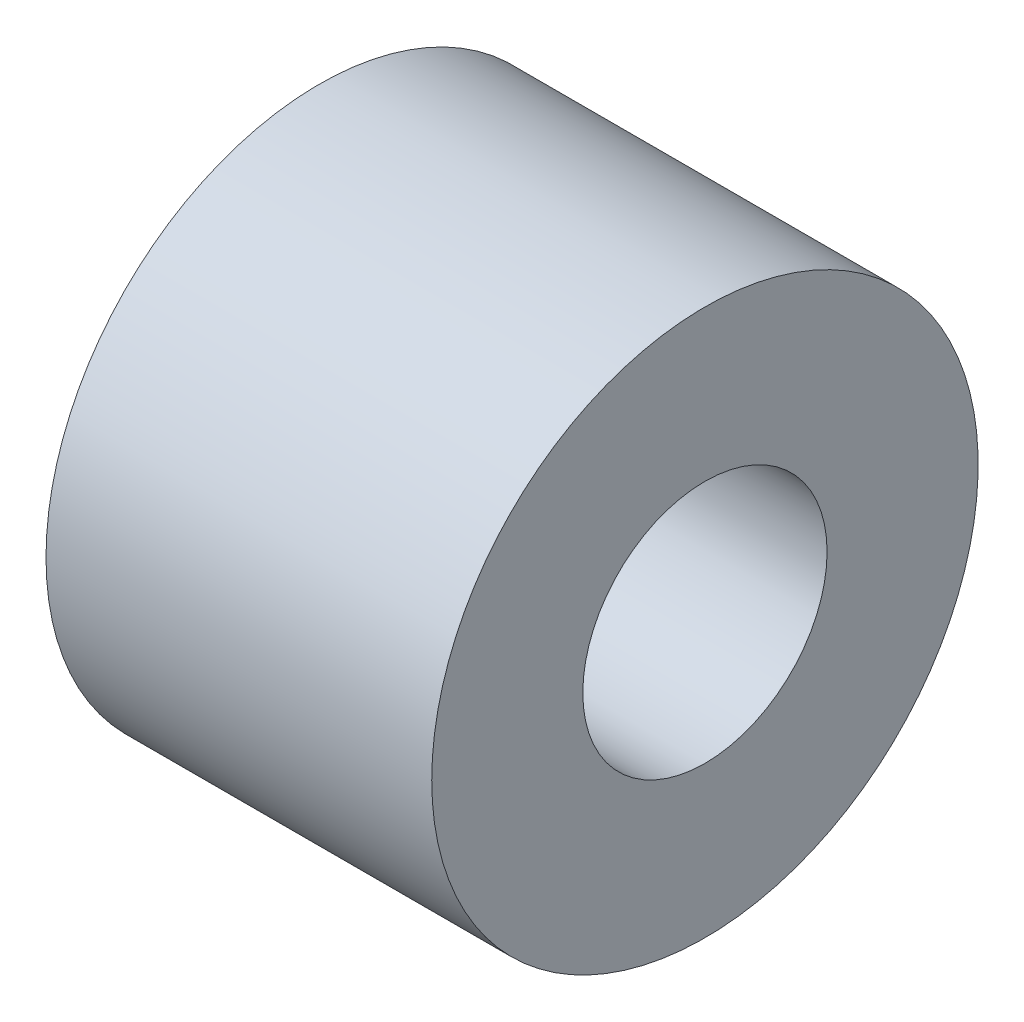
ISO-10303-21;
HEADER;
FILE_DESCRIPTION(('STEP AP214'),'2;1');
FILE_NAME('part.step','',(''),(''),'','','');
FILE_SCHEMA(('AUTOMOTIVE_DESIGN { 1 0 10303 214 1 1 1 1 }'));
ENDSEC;
DATA;
#1=APPLICATION_CONTEXT('core data for automotive mechanical design processes');
#2=APPLICATION_PROTOCOL_DEFINITION('international standard','automotive_design',2000,#1);
#3=PRODUCT_CONTEXT('',#1,'mechanical');
#4=PRODUCT('Part','Part','',(#3));
#5=PRODUCT_RELATED_PRODUCT_CATEGORY('part','',(#4));
#6=PRODUCT_DEFINITION_FORMATION('','',#4);
#7=PRODUCT_DEFINITION_CONTEXT('part definition',#1,'design');
#8=PRODUCT_DEFINITION('design','',#6,#7);
#9=PRODUCT_DEFINITION_SHAPE('','',#8);
#10=(LENGTH_UNIT() NAMED_UNIT(*) SI_UNIT(.MILLI.,.METRE.));
#11=(NAMED_UNIT(*) PLANE_ANGLE_UNIT() SI_UNIT($,.RADIAN.));
#12=(NAMED_UNIT(*) SI_UNIT($,.STERADIAN.) SOLID_ANGLE_UNIT());
#13=UNCERTAINTY_MEASURE_WITH_UNIT(LENGTH_MEASURE(1.E-05),#10,'distance_accuracy_value','');
#14=(GEOMETRIC_REPRESENTATION_CONTEXT(3) GLOBAL_UNCERTAINTY_ASSIGNED_CONTEXT((#13)) GLOBAL_UNIT_ASSIGNED_CONTEXT((#10,
#11,#12)) REPRESENTATION_CONTEXT('',''));
#15=CARTESIAN_POINT('',(0.,0.,0.));
#16=DIRECTION('',(0.,0.,1.));
#17=DIRECTION('',(1.,0.,0.));
#18=AXIS2_PLACEMENT_3D('',#15,#16,#17);
#19=CARTESIAN_POINT('',(3.81,0.,0.));
#20=DIRECTION('',(1.,0.,0.));
#21=DIRECTION('',(0.,0.,-1.));
#22=AXIS2_PLACEMENT_3D('',#19,#20,#21);
#23=PLANE('',#22);
#24=CARTESIAN_POINT('',(3.81,0.,0.));
#25=DIRECTION('',(1.,0.,0.));
#26=DIRECTION('',(0.,0.,-1.));
#27=AXIS2_PLACEMENT_3D('',#24,#25,#26);
#28=CIRCLE('',#27,5.3975);
#29=CARTESIAN_POINT('',(3.81,0.,5.3975));
#30=VERTEX_POINT('',#29);
#31=EDGE_CURVE('E10',#30,#30,#28,.T.);
#32=ORIENTED_EDGE('',*,*,#31,.T.);
#33=EDGE_LOOP('',(#32));
#34=FACE_BOUND('',#33,.T.);
#35=CARTESIAN_POINT('',(3.81,0.,0.));
#36=DIRECTION('',(1.,0.,0.));
#37=DIRECTION('',(0.,0.,-1.));
#38=AXIS2_PLACEMENT_3D('',#35,#36,#37);
#39=CIRCLE('',#38,2.413);
#40=CARTESIAN_POINT('',(3.81,0.,2.413));
#41=VERTEX_POINT('',#40);
#42=EDGE_CURVE('E48',#41,#41,#39,.T.);
#43=ORIENTED_EDGE('',*,*,#42,.F.);
#44=EDGE_LOOP('',(#43));
#45=FACE_BOUND('',#44,.T.);
#46=ADVANCED_FACE('F37',(#34,#45),#23,.T.);
#47=CARTESIAN_POINT('',(-3.81,0.,0.));
#48=DIRECTION('',(1.,0.,0.));
#49=DIRECTION('',(0.,0.,-1.));
#50=AXIS2_PLACEMENT_3D('',#47,#48,#49);
#51=PLANE('',#50);
#52=CARTESIAN_POINT('',(-3.81,0.,0.));
#53=DIRECTION('',(1.,0.,0.));
#54=DIRECTION('',(0.,0.,-1.));
#55=AXIS2_PLACEMENT_3D('',#52,#53,#54);
#56=CIRCLE('',#55,5.3975);
#57=CARTESIAN_POINT('',(-3.81,0.,5.3975));
#58=VERTEX_POINT('',#57);
#59=EDGE_CURVE('E41',#58,#58,#56,.T.);
#60=ORIENTED_EDGE('',*,*,#59,.F.);
#61=EDGE_LOOP('',(#60));
#62=FACE_BOUND('',#61,.T.);
#63=CARTESIAN_POINT('',(-3.81,0.,0.));
#64=DIRECTION('',(1.,0.,0.));
#65=DIRECTION('',(0.,0.,-1.));
#66=AXIS2_PLACEMENT_3D('',#63,#64,#65);
#67=CIRCLE('',#66,2.413);
#68=CARTESIAN_POINT('',(-3.81,0.,2.413));
#69=VERTEX_POINT('',#68);
#70=EDGE_CURVE('E50',#69,#69,#67,.T.);
#71=ORIENTED_EDGE('',*,*,#70,.T.);
#72=EDGE_LOOP('',(#71));
#73=FACE_BOUND('',#72,.T.);
#74=ADVANCED_FACE('F60',(#62,#73),#51,.F.);
#75=CARTESIAN_POINT('',(3.81,0.,0.));
#76=DIRECTION('',(-1.,0.,0.));
#77=DIRECTION('',(0.,0.,1.));
#78=AXIS2_PLACEMENT_3D('',#75,#76,#77);
#79=CYLINDRICAL_SURFACE('',#78,5.3975);
#80=CARTESIAN_POINT('',(3.81,0.,5.3975));
#81=CARTESIAN_POINT('',(3.730625,0.,5.3975));
#82=CARTESIAN_POINT('',(3.65125,0.,5.3975));
#83=CARTESIAN_POINT('',(3.4925,0.,5.3975));
#84=CARTESIAN_POINT('',(3.413125,0.,5.3975));
#85=CARTESIAN_POINT('',(3.254375,0.,5.3975));
#86=CARTESIAN_POINT('',(3.175,0.,5.3975));
#87=CARTESIAN_POINT('',(3.01625,0.,5.3975));
#88=CARTESIAN_POINT('',(2.936875,0.,5.3975));
#89=CARTESIAN_POINT('',(2.778125,0.,5.3975));
#90=CARTESIAN_POINT('',(2.69875,0.,5.3975));
#91=CARTESIAN_POINT('',(2.54,0.,5.3975));
#92=CARTESIAN_POINT('',(2.460625,0.,5.3975));
#93=CARTESIAN_POINT('',(2.301875,0.,5.3975));
#94=CARTESIAN_POINT('',(2.2225,0.,5.3975));
#95=CARTESIAN_POINT('',(2.06375,0.,5.3975));
#96=CARTESIAN_POINT('',(1.984375,0.,5.3975));
#97=CARTESIAN_POINT('',(1.825625,0.,5.3975));
#98=CARTESIAN_POINT('',(1.74625,0.,5.3975));
#99=CARTESIAN_POINT('',(1.5875,0.,5.3975));
#100=CARTESIAN_POINT('',(1.508125,0.,5.3975));
#101=CARTESIAN_POINT('',(1.349375,0.,5.3975));
#102=CARTESIAN_POINT('',(1.27,0.,5.3975));
#103=CARTESIAN_POINT('',(1.11125,0.,5.3975));
#104=CARTESIAN_POINT('',(1.031875,0.,5.3975));
#105=CARTESIAN_POINT('',(0.873125,0.,5.3975));
#106=CARTESIAN_POINT('',(0.79375,0.,5.3975));
#107=CARTESIAN_POINT('',(0.635,0.,5.3975));
#108=CARTESIAN_POINT('',(0.555625,0.,5.3975));
#109=CARTESIAN_POINT('',(0.396875,0.,5.3975));
#110=CARTESIAN_POINT('',(0.3175,0.,5.3975));
#111=CARTESIAN_POINT('',(0.15875,0.,5.3975));
#112=CARTESIAN_POINT('',(0.0793749999999996,0.,5.3975));
#113=CARTESIAN_POINT('',(-0.079375,0.,5.3975));
#114=CARTESIAN_POINT('',(-0.15875,0.,5.3975));
#115=CARTESIAN_POINT('',(-0.317499999999999,0.,5.3975));
#116=CARTESIAN_POINT('',(-0.396874999999999,0.,5.3975));
#117=CARTESIAN_POINT('',(-0.555625,0.,5.3975));
#118=CARTESIAN_POINT('',(-0.634999999999999,0.,5.3975));
#119=CARTESIAN_POINT('',(-0.79375,0.,5.3975));
#120=CARTESIAN_POINT('',(-0.873125,0.,5.3975));
#121=CARTESIAN_POINT('',(-1.031875,0.,5.3975));
#122=CARTESIAN_POINT('',(-1.11125,0.,5.3975));
#123=CARTESIAN_POINT('',(-1.27,0.,5.3975));
#124=CARTESIAN_POINT('',(-1.349375,0.,5.3975));
#125=CARTESIAN_POINT('',(-1.508125,0.,5.3975));
#126=CARTESIAN_POINT('',(-1.5875,0.,5.3975));
#127=CARTESIAN_POINT('',(-1.74625,0.,5.3975));
#128=CARTESIAN_POINT('',(-1.825625,0.,5.3975));
#129=CARTESIAN_POINT('',(-1.984375,0.,5.3975));
#130=CARTESIAN_POINT('',(-2.06375,0.,5.3975));
#131=CARTESIAN_POINT('',(-2.2225,0.,5.3975));
#132=CARTESIAN_POINT('',(-2.301875,0.,5.3975));
#133=CARTESIAN_POINT('',(-2.460625,0.,5.3975));
#134=CARTESIAN_POINT('',(-2.54,0.,5.3975));
#135=CARTESIAN_POINT('',(-2.69875,0.,5.3975));
#136=CARTESIAN_POINT('',(-2.778125,0.,5.3975));
#137=CARTESIAN_POINT('',(-2.936875,0.,5.3975));
#138=CARTESIAN_POINT('',(-3.01625,0.,5.3975));
#139=CARTESIAN_POINT('',(-3.175,0.,5.3975));
#140=CARTESIAN_POINT('',(-3.254375,0.,5.3975));
#141=CARTESIAN_POINT('',(-3.413125,0.,5.3975));
#142=CARTESIAN_POINT('',(-3.4925,0.,5.3975));
#143=CARTESIAN_POINT('',(-3.65125,0.,5.3975));
#144=CARTESIAN_POINT('',(-3.730625,0.,5.3975));
#145=CARTESIAN_POINT('',(-3.81,0.,5.3975));
#146=B_SPLINE_CURVE_WITH_KNOTS('',3,(#80,#81,#82,#83,#84,#85,#86,#87,#88,#89,#90,#91,#92,#93,
#94,#95,#96,#97,#98,#99,#100,#101,#102,#103,#104,#105,#106,#107,#108,#109,#110,#111,#112,#113,
#114,#115,#116,#117,#118,#119,#120,#121,#122,#123,#124,#125,#126,#127,#128,#129,#130,#131,#132,
#133,#134,#135,#136,#137,#138,#139,#140,#141,#142,#143,#144,#145),.UNSPECIFIED.,.F.,.F.,(4,2,2,
2,2,2,2,2,2,2,2,2,2,2,2,2,2,2,2,2,2,2,2,2,2,2,2,2,2,2,2,2,4),(0.,0.238125,0.47625,0.714375,
0.9525,1.190625,1.42875,1.666875,1.905,2.143125,2.38125,2.619375,2.8575,3.095625,3.33375,
3.571875,3.81,4.048125,4.28625,4.524375,4.7625,5.000625,5.23875,5.476875,5.715,5.953125,6.19125,
6.429375,6.6675,6.905625,7.14375,7.381875,7.62),.UNSPECIFIED.);
#147=EDGE_CURVE('BSEAM39',#30,#58,#146,.T.);
#148=ORIENTED_EDGE('',*,*,#31,.F.);
#149=ORIENTED_EDGE('',*,*,#59,.T.);
#150=ORIENTED_EDGE('',*,*,#147,.T.);
#151=ORIENTED_EDGE('',*,*,#147,.F.);
#152=EDGE_LOOP('',(#148,#150,#149,#151));
#153=FACE_BOUND('',#152,.T.);
#154=ADVANCED_FACE('F39',(#153),#79,.T.);
#155=CARTESIAN_POINT('',(3.81,0.,0.));
#156=DIRECTION('',(-1.,0.,0.));
#157=DIRECTION('',(0.,0.,1.));
#158=AXIS2_PLACEMENT_3D('',#155,#156,#157);
#159=CYLINDRICAL_SURFACE('',#158,2.413);
#160=CARTESIAN_POINT('',(3.81,0.,2.413));
#161=CARTESIAN_POINT('',(3.730625,0.,2.413));
#162=CARTESIAN_POINT('',(3.65125,0.,2.413));
#163=CARTESIAN_POINT('',(3.4925,0.,2.413));
#164=CARTESIAN_POINT('',(3.413125,0.,2.413));
#165=CARTESIAN_POINT('',(3.254375,0.,2.413));
#166=CARTESIAN_POINT('',(3.175,0.,2.413));
#167=CARTESIAN_POINT('',(3.01625,0.,2.413));
#168=CARTESIAN_POINT('',(2.936875,0.,2.413));
#169=CARTESIAN_POINT('',(2.778125,0.,2.413));
#170=CARTESIAN_POINT('',(2.69875,0.,2.413));
#171=CARTESIAN_POINT('',(2.54,0.,2.413));
#172=CARTESIAN_POINT('',(2.460625,0.,2.413));
#173=CARTESIAN_POINT('',(2.301875,0.,2.413));
#174=CARTESIAN_POINT('',(2.2225,0.,2.413));
#175=CARTESIAN_POINT('',(2.06375,0.,2.413));
#176=CARTESIAN_POINT('',(1.984375,0.,2.413));
#177=CARTESIAN_POINT('',(1.825625,0.,2.413));
#178=CARTESIAN_POINT('',(1.74625,0.,2.413));
#179=CARTESIAN_POINT('',(1.5875,0.,2.413));
#180=CARTESIAN_POINT('',(1.508125,0.,2.413));
#181=CARTESIAN_POINT('',(1.349375,0.,2.413));
#182=CARTESIAN_POINT('',(1.27,0.,2.413));
#183=CARTESIAN_POINT('',(1.11125,0.,2.413));
#184=CARTESIAN_POINT('',(1.031875,0.,2.413));
#185=CARTESIAN_POINT('',(0.873125,0.,2.413));
#186=CARTESIAN_POINT('',(0.79375,0.,2.413));
#187=CARTESIAN_POINT('',(0.635,0.,2.413));
#188=CARTESIAN_POINT('',(0.555625,0.,2.413));
#189=CARTESIAN_POINT('',(0.396875,0.,2.413));
#190=CARTESIAN_POINT('',(0.3175,0.,2.413));
#191=CARTESIAN_POINT('',(0.15875,0.,2.413));
#192=CARTESIAN_POINT('',(0.079375,0.,2.413));
#193=CARTESIAN_POINT('',(-0.0793749999999997,0.,2.413));
#194=CARTESIAN_POINT('',(-0.158749999999999,0.,2.413));
#195=CARTESIAN_POINT('',(-0.317499999999999,0.,2.413));
#196=CARTESIAN_POINT('',(-0.396874999999999,0.,2.413));
#197=CARTESIAN_POINT('',(-0.555625,0.,2.413));
#198=CARTESIAN_POINT('',(-0.634999999999999,0.,2.413));
#199=CARTESIAN_POINT('',(-0.79375,0.,2.413));
#200=CARTESIAN_POINT('',(-0.873125,0.,2.413));
#201=CARTESIAN_POINT('',(-1.031875,0.,2.413));
#202=CARTESIAN_POINT('',(-1.11125,0.,2.413));
#203=CARTESIAN_POINT('',(-1.27,0.,2.413));
#204=CARTESIAN_POINT('',(-1.349375,0.,2.413));
#205=CARTESIAN_POINT('',(-1.508125,0.,2.413));
#206=CARTESIAN_POINT('',(-1.5875,0.,2.413));
#207=CARTESIAN_POINT('',(-1.74625,0.,2.413));
#208=CARTESIAN_POINT('',(-1.825625,0.,2.413));
#209=CARTESIAN_POINT('',(-1.984375,0.,2.413));
#210=CARTESIAN_POINT('',(-2.06375,0.,2.413));
#211=CARTESIAN_POINT('',(-2.2225,0.,2.413));
#212=CARTESIAN_POINT('',(-2.301875,0.,2.413));
#213=CARTESIAN_POINT('',(-2.460625,0.,2.413));
#214=CARTESIAN_POINT('',(-2.54,0.,2.413));
#215=CARTESIAN_POINT('',(-2.69875,0.,2.413));
#216=CARTESIAN_POINT('',(-2.778125,0.,2.413));
#217=CARTESIAN_POINT('',(-2.936875,0.,2.413));
#218=CARTESIAN_POINT('',(-3.01625,0.,2.413));
#219=CARTESIAN_POINT('',(-3.175,0.,2.413));
#220=CARTESIAN_POINT('',(-3.254375,0.,2.413));
#221=CARTESIAN_POINT('',(-3.413125,0.,2.413));
#222=CARTESIAN_POINT('',(-3.4925,0.,2.413));
#223=CARTESIAN_POINT('',(-3.65125,0.,2.413));
#224=CARTESIAN_POINT('',(-3.730625,0.,2.413));
#225=CARTESIAN_POINT('',(-3.81,0.,2.413));
#226=B_SPLINE_CURVE_WITH_KNOTS('',3,(#160,#161,#162,#163,#164,#165,#166,#167,#168,#169,#170,
#171,#172,#173,#174,#175,#176,#177,#178,#179,#180,#181,#182,#183,#184,#185,#186,#187,#188,#189,
#190,#191,#192,#193,#194,#195,#196,#197,#198,#199,#200,#201,#202,#203,#204,#205,#206,#207,#208,
#209,#210,#211,#212,#213,#214,#215,#216,#217,#218,#219,#220,#221,#222,#223,#224,#225),
.UNSPECIFIED.,.F.,.F.,(4,2,2,2,2,2,2,2,2,2,2,2,2,2,2,2,2,2,2,2,2,2,2,2,2,2,2,2,2,2,2,2,4),(0.,
0.238125,0.47625,0.714375,0.9525,1.190625,1.42875,1.666875,1.905,2.143125,2.38125,2.619375,
2.8575,3.095625,3.33375,3.571875,3.81,4.048125,4.28625,4.524375,4.7625,5.000625,5.23875,
5.476875,5.715,5.953125,6.19125,6.429375,6.6675,6.905625,7.14375,7.381875,7.62),.UNSPECIFIED.);
#227=EDGE_CURVE('BSEAM56',#41,#69,#226,.T.);
#228=ORIENTED_EDGE('',*,*,#42,.T.);
#229=ORIENTED_EDGE('',*,*,#70,.F.);
#230=ORIENTED_EDGE('',*,*,#227,.T.);
#231=ORIENTED_EDGE('',*,*,#227,.F.);
#232=EDGE_LOOP('',(#228,#230,#229,#231));
#233=FACE_BOUND('',#232,.T.);
#234=ADVANCED_FACE('F56',(#233),#159,.F.);
#235=CLOSED_SHELL('',(#46,#74,#154,#234));
#236=MANIFOLD_SOLID_BREP('B2',#235);
#237=ADVANCED_BREP_SHAPE_REPRESENTATION('',(#18,#236),#14);
#238=SHAPE_DEFINITION_REPRESENTATION(#9,#237);
ENDSEC;
END-ISO-10303-21;
